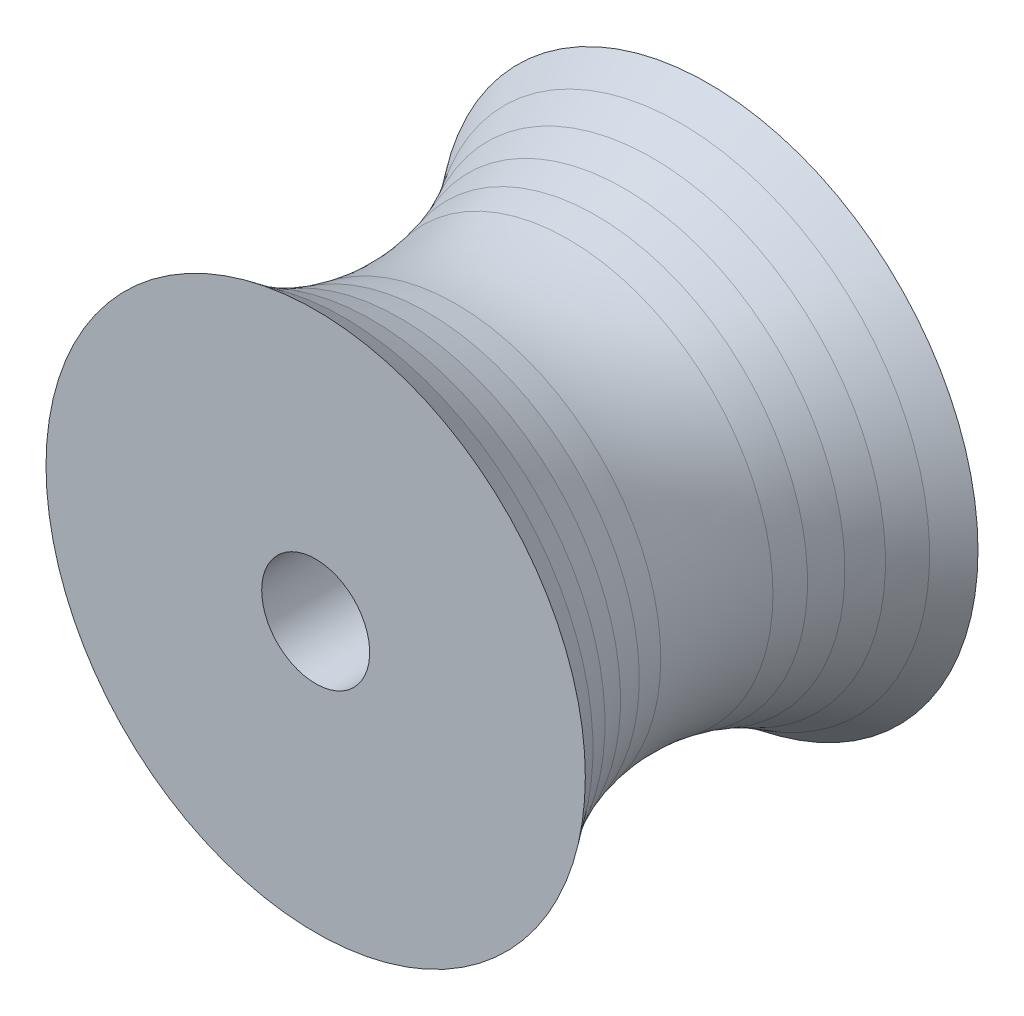
ISO-10303-21;
HEADER;
FILE_DESCRIPTION(('STEP AP214'),'2;1');
FILE_NAME('part.step','',(''),(''),'','','');
FILE_SCHEMA(('AUTOMOTIVE_DESIGN { 1 0 10303 214 1 1 1 1 }'));
ENDSEC;
DATA;
#1=APPLICATION_CONTEXT('core data for automotive mechanical design processes');
#2=APPLICATION_PROTOCOL_DEFINITION('international standard','automotive_design',2000,#1);
#3=PRODUCT_CONTEXT('',#1,'mechanical');
#4=PRODUCT('Part','Part','',(#3));
#5=PRODUCT_RELATED_PRODUCT_CATEGORY('part','',(#4));
#6=PRODUCT_DEFINITION_FORMATION('','',#4);
#7=PRODUCT_DEFINITION_CONTEXT('part definition',#1,'design');
#8=PRODUCT_DEFINITION('design','',#6,#7);
#9=PRODUCT_DEFINITION_SHAPE('','',#8);
#10=(LENGTH_UNIT() NAMED_UNIT(*) SI_UNIT(.MILLI.,.METRE.));
#11=(NAMED_UNIT(*) PLANE_ANGLE_UNIT() SI_UNIT($,.RADIAN.));
#12=(NAMED_UNIT(*) SI_UNIT($,.STERADIAN.) SOLID_ANGLE_UNIT());
#13=UNCERTAINTY_MEASURE_WITH_UNIT(LENGTH_MEASURE(1.E-05),#10,'distance_accuracy_value','');
#14=(GEOMETRIC_REPRESENTATION_CONTEXT(3) GLOBAL_UNCERTAINTY_ASSIGNED_CONTEXT((#13)) GLOBAL_UNIT_ASSIGNED_CONTEXT((#10,
#11,#12)) REPRESENTATION_CONTEXT('',''));
#15=CARTESIAN_POINT('',(0.,0.,0.));
#16=DIRECTION('',(0.,0.,1.));
#17=DIRECTION('',(1.,0.,0.));
#18=AXIS2_PLACEMENT_3D('',#15,#16,#17);
#19=CARTESIAN_POINT('',(27.4699673868949,0.,20.));
#20=DIRECTION('',(0.,0.,-1.));
#21=DIRECTION('',(-1.,0.,0.));
#22=AXIS2_PLACEMENT_3D('',#19,#20,#21);
#23=PLANE('',#22);
#24=CARTESIAN_POINT('',(0.,0.,20.));
#25=DIRECTION('',(0.,0.,-1.));
#26=DIRECTION('',(-1.,0.,0.));
#27=AXIS2_PLACEMENT_3D('',#24,#25,#26);
#28=CIRCLE('',#27,27.4699673868949);
#29=CARTESIAN_POINT('',(-27.4699673868949,0.,20.));
#30=VERTEX_POINT('',#29);
#31=EDGE_CURVE('E10',#30,#30,#28,.T.);
#32=ORIENTED_EDGE('',*,*,#31,.F.);
#33=EDGE_LOOP('',(#32));
#34=FACE_BOUND('',#33,.T.);
#35=CARTESIAN_POINT('',(0.,0.,20.));
#36=DIRECTION('',(0.,0.,-1.));
#37=DIRECTION('',(-1.,0.,0.));
#38=AXIS2_PLACEMENT_3D('',#35,#36,#37);
#39=CIRCLE('',#38,5.5);
#40=CARTESIAN_POINT('',(-5.5,0.,20.));
#41=VERTEX_POINT('',#40);
#42=EDGE_CURVE('E81',#41,#41,#39,.T.);
#43=ORIENTED_EDGE('',*,*,#42,.T.);
#44=EDGE_LOOP('',(#43));
#45=FACE_BOUND('',#44,.T.);
#46=ADVANCED_FACE('F40',(#34,#45),#23,.F.);
#47=CARTESIAN_POINT('',(0.,0.,20.));
#48=DIRECTION('',(0.,0.,1.));
#49=DIRECTION('',(1.,0.,0.));
#50=AXIS2_PLACEMENT_3D('',#47,#48,#49);
#51=CONICAL_SURFACE('',#50,27.4699673868949,0.628201058045388);
#52=CARTESIAN_POINT('',(0.,0.,17.1428571428571));
#53=DIRECTION('',(0.,0.,-1.));
#54=DIRECTION('',(-1.,0.,0.));
#55=AXIS2_PLACEMENT_3D('',#52,#53,#54);
#56=CIRCLE('',#55,25.3946443553259);
#57=CARTESIAN_POINT('',(-25.3946443553259,0.,17.1428571428571));
#58=VERTEX_POINT('',#57);
#59=EDGE_CURVE('E43',#58,#58,#56,.T.);
#60=ORIENTED_EDGE('',*,*,#59,.F.);
#61=EDGE_LOOP('',(#60));
#62=FACE_BOUND('',#61,.T.);
#63=ORIENTED_EDGE('',*,*,#31,.T.);
#64=EDGE_LOOP('',(#63));
#65=FACE_BOUND('',#64,.T.);
#66=ADVANCED_FACE('F157',(#62,#65),#51,.T.);
#67=CARTESIAN_POINT('',(0.,0.,17.1428571428571));
#68=DIRECTION('',(0.,0.,1.));
#69=DIRECTION('',(1.,0.,0.));
#70=AXIS2_PLACEMENT_3D('',#67,#68,#69);
#71=CONICAL_SURFACE('',#70,25.3946443553259,0.520339936939646);
#72=CARTESIAN_POINT('',(0.,0.,14.2857142857143));
#73=DIRECTION('',(0.,0.,-1.));
#74=DIRECTION('',(-1.,0.,0.));
#75=AXIS2_PLACEMENT_3D('',#72,#73,#74);
#76=CIRCLE('',#75,23.7574635107443);
#77=CARTESIAN_POINT('',(-23.7574635107443,0.,14.2857142857143));
#78=VERTEX_POINT('',#77);
#79=EDGE_CURVE('E50',#78,#78,#76,.T.);
#80=ORIENTED_EDGE('',*,*,#79,.F.);
#81=EDGE_LOOP('',(#80));
#82=FACE_BOUND('',#81,.T.);
#83=ORIENTED_EDGE('',*,*,#59,.T.);
#84=EDGE_LOOP('',(#83));
#85=FACE_BOUND('',#84,.T.);
#86=ADVANCED_FACE('F152',(#82,#85),#71,.T.);
#87=CARTESIAN_POINT('',(0.,0.,14.2857142857143));
#88=DIRECTION('',(0.,0.,1.));
#89=DIRECTION('',(1.,0.,0.));
#90=AXIS2_PLACEMENT_3D('',#87,#88,#89);
#91=CONICAL_SURFACE('',#90,23.7574635107443,0.418866911837247);
#92=CARTESIAN_POINT('',(0.,0.,11.4285714285714));
#93=DIRECTION('',(0.,0.,-1.));
#94=DIRECTION('',(-1.,0.,0.));
#95=AXIS2_PLACEMENT_3D('',#92,#93,#94);
#96=CIRCLE('',#95,22.4854230065542);
#97=CARTESIAN_POINT('',(-22.4854230065542,0.,11.4285714285714));
#98=VERTEX_POINT('',#97);
#99=EDGE_CURVE('E51',#98,#98,#96,.T.);
#100=ORIENTED_EDGE('',*,*,#99,.F.);
#101=EDGE_LOOP('',(#100));
#102=FACE_BOUND('',#101,.T.);
#103=ORIENTED_EDGE('',*,*,#79,.T.);
#104=EDGE_LOOP('',(#103));
#105=FACE_BOUND('',#104,.T.);
#106=ADVANCED_FACE('F144',(#102,#105),#91,.T.);
#107=CARTESIAN_POINT('',(0.,0.,11.4285714285714));
#108=DIRECTION('',(0.,0.,1.));
#109=DIRECTION('',(1.,0.,0.));
#110=AXIS2_PLACEMENT_3D('',#107,#108,#109);
#111=CONICAL_SURFACE('',#110,22.4854230065542,0.321841461472372);
#112=CARTESIAN_POINT('',(0.,0.,8.57142857142857));
#113=DIRECTION('',(0.,0.,-1.));
#114=DIRECTION('',(-1.,0.,0.));
#115=AXIS2_PLACEMENT_3D('',#112,#113,#114);
#116=CIRCLE('',#115,21.5327534515359);
#117=CARTESIAN_POINT('',(-21.5327534515359,0.,8.57142857142857));
#118=VERTEX_POINT('',#117);
#119=EDGE_CURVE('E57',#118,#118,#116,.T.);
#120=ORIENTED_EDGE('',*,*,#119,.F.);
#121=EDGE_LOOP('',(#120));
#122=FACE_BOUND('',#121,.T.);
#123=ORIENTED_EDGE('',*,*,#99,.T.);
#124=EDGE_LOOP('',(#123));
#125=FACE_BOUND('',#124,.T.);
#126=ADVANCED_FACE('F137',(#122,#125),#111,.T.);
#127=CARTESIAN_POINT('',(0.,0.,8.57142857142857));
#128=DIRECTION('',(0.,0.,1.));
#129=DIRECTION('',(1.,0.,0.));
#130=AXIS2_PLACEMENT_3D('',#127,#128,#129);
#131=CONICAL_SURFACE('',#130,21.5327534515359,0.227892830475359);
#132=CARTESIAN_POINT('',(0.,0.,5.71428571428571));
#133=DIRECTION('',(0.,0.,-1.));
#134=DIRECTION('',(-1.,0.,0.));
#135=AXIS2_PLACEMENT_3D('',#132,#133,#134);
#136=CIRCLE('',#135,20.8701198400072);
#137=CARTESIAN_POINT('',(-20.8701198400072,0.,5.71428571428571));
#138=VERTEX_POINT('',#137);
#139=EDGE_CURVE('E56',#138,#138,#136,.T.);
#140=ORIENTED_EDGE('',*,*,#139,.F.);
#141=EDGE_LOOP('',(#140));
#142=FACE_BOUND('',#141,.T.);
#143=ORIENTED_EDGE('',*,*,#119,.T.);
#144=EDGE_LOOP('',(#143));
#145=FACE_BOUND('',#144,.T.);
#146=ADVANCED_FACE('F133',(#142,#145),#131,.T.);
#147=CARTESIAN_POINT('',(0.,0.,0.));
#148=DIRECTION('',(0.,0.,-1.));
#149=DIRECTION('',(-1.,0.,0.));
#150=AXIS2_PLACEMENT_3D('',#147,#148,#149);
#151=TOROIDAL_SURFACE('',#150,52.0000000000004,31.6500000000004);
#152=CARTESIAN_POINT('',(0.,0.,-5.71428571428571));
#153=DIRECTION('',(0.,0.,-1.));
#154=DIRECTION('',(-1.,0.,0.));
#155=AXIS2_PLACEMENT_3D('',#152,#153,#154);
#156=CIRCLE('',#155,20.8701198400073);
#157=CARTESIAN_POINT('',(-20.8701198400073,0.,-5.71428571428571));
#158=VERTEX_POINT('',#157);
#159=EDGE_CURVE('E64',#158,#158,#156,.T.);
#160=ORIENTED_EDGE('',*,*,#159,.F.);
#161=EDGE_LOOP('',(#160));
#162=FACE_BOUND('',#161,.T.);
#163=ORIENTED_EDGE('',*,*,#139,.T.);
#164=EDGE_LOOP('',(#163));
#165=FACE_BOUND('',#164,.T.);
#166=ADVANCED_FACE('F130',(#162,#165),#151,.F.);
#167=CARTESIAN_POINT('',(0.,0.,-5.71428571428571));
#168=DIRECTION('',(0.,0.,-1.));
#169=DIRECTION('',(-1.,0.,0.));
#170=AXIS2_PLACEMENT_3D('',#167,#168,#169);
#171=CONICAL_SURFACE('',#170,20.8701198400073,0.227892830475356);
#172=CARTESIAN_POINT('',(0.,0.,-8.57142857142857));
#173=DIRECTION('',(0.,0.,-1.));
#174=DIRECTION('',(-1.,0.,0.));
#175=AXIS2_PLACEMENT_3D('',#172,#173,#174);
#176=CIRCLE('',#175,21.5327534515359);
#177=CARTESIAN_POINT('',(-21.5327534515359,0.,-8.57142857142857));
#178=VERTEX_POINT('',#177);
#179=EDGE_CURVE('E63',#178,#178,#176,.T.);
#180=ORIENTED_EDGE('',*,*,#179,.F.);
#181=EDGE_LOOP('',(#180));
#182=FACE_BOUND('',#181,.T.);
#183=ORIENTED_EDGE('',*,*,#159,.T.);
#184=EDGE_LOOP('',(#183));
#185=FACE_BOUND('',#184,.T.);
#186=ADVANCED_FACE('F123',(#182,#185),#171,.T.);
#187=CARTESIAN_POINT('',(0.,0.,-8.57142857142857));
#188=DIRECTION('',(0.,0.,-1.));
#189=DIRECTION('',(-1.,0.,0.));
#190=AXIS2_PLACEMENT_3D('',#187,#188,#189);
#191=CONICAL_SURFACE('',#190,21.5327534515359,0.321841461472371);
#192=CARTESIAN_POINT('',(0.,0.,-11.4285714285714));
#193=DIRECTION('',(0.,0.,-1.));
#194=DIRECTION('',(-1.,0.,0.));
#195=AXIS2_PLACEMENT_3D('',#192,#193,#194);
#196=CIRCLE('',#195,22.4854230065542);
#197=CARTESIAN_POINT('',(-22.4854230065542,0.,-11.4285714285714));
#198=VERTEX_POINT('',#197);
#199=EDGE_CURVE('E66',#198,#198,#196,.T.);
#200=ORIENTED_EDGE('',*,*,#199,.F.);
#201=EDGE_LOOP('',(#200));
#202=FACE_BOUND('',#201,.T.);
#203=ORIENTED_EDGE('',*,*,#179,.T.);
#204=EDGE_LOOP('',(#203));
#205=FACE_BOUND('',#204,.T.);
#206=ADVANCED_FACE('F113',(#202,#205),#191,.T.);
#207=CARTESIAN_POINT('',(0.,0.,-11.4285714285714));
#208=DIRECTION('',(0.,0.,-1.));
#209=DIRECTION('',(-1.,0.,0.));
#210=AXIS2_PLACEMENT_3D('',#207,#208,#209);
#211=CONICAL_SURFACE('',#210,22.4854230065542,0.418866911837247);
#212=CARTESIAN_POINT('',(0.,0.,-14.2857142857143));
#213=DIRECTION('',(0.,0.,-1.));
#214=DIRECTION('',(-1.,0.,0.));
#215=AXIS2_PLACEMENT_3D('',#212,#213,#214);
#216=CIRCLE('',#215,23.7574635107443);
#217=CARTESIAN_POINT('',(-23.7574635107443,0.,-14.2857142857143));
#218=VERTEX_POINT('',#217);
#219=EDGE_CURVE('E72',#218,#218,#216,.T.);
#220=ORIENTED_EDGE('',*,*,#219,.F.);
#221=EDGE_LOOP('',(#220));
#222=FACE_BOUND('',#221,.T.);
#223=ORIENTED_EDGE('',*,*,#199,.T.);
#224=EDGE_LOOP('',(#223));
#225=FACE_BOUND('',#224,.T.);
#226=ADVANCED_FACE('F106',(#222,#225),#211,.T.);
#227=CARTESIAN_POINT('',(0.,0.,-14.2857142857143));
#228=DIRECTION('',(0.,0.,-1.));
#229=DIRECTION('',(-1.,0.,0.));
#230=AXIS2_PLACEMENT_3D('',#227,#228,#229);
#231=CONICAL_SURFACE('',#230,23.7574635107443,0.520339936939647);
#232=CARTESIAN_POINT('',(0.,0.,-17.1428571428571));
#233=DIRECTION('',(0.,0.,-1.));
#234=DIRECTION('',(-1.,0.,0.));
#235=AXIS2_PLACEMENT_3D('',#232,#233,#234);
#236=CIRCLE('',#235,25.3946443553259);
#237=CARTESIAN_POINT('',(-25.3946443553259,0.,-17.1428571428571));
#238=VERTEX_POINT('',#237);
#239=EDGE_CURVE('E71',#238,#238,#236,.T.);
#240=ORIENTED_EDGE('',*,*,#239,.F.);
#241=EDGE_LOOP('',(#240));
#242=FACE_BOUND('',#241,.T.);
#243=ORIENTED_EDGE('',*,*,#219,.T.);
#244=EDGE_LOOP('',(#243));
#245=FACE_BOUND('',#244,.T.);
#246=ADVANCED_FACE('F104',(#242,#245),#231,.T.);
#247=CARTESIAN_POINT('',(0.,0.,-17.1428571428571));
#248=DIRECTION('',(0.,0.,-1.));
#249=DIRECTION('',(-1.,0.,0.));
#250=AXIS2_PLACEMENT_3D('',#247,#248,#249);
#251=CONICAL_SURFACE('',#250,25.3946443553259,0.628201058045387);
#252=CARTESIAN_POINT('',(0.,0.,-20.));
#253=DIRECTION('',(0.,0.,-1.));
#254=DIRECTION('',(-1.,0.,0.));
#255=AXIS2_PLACEMENT_3D('',#252,#253,#254);
#256=CIRCLE('',#255,27.4699673868949);
#257=CARTESIAN_POINT('',(-27.4699673868949,0.,-20.));
#258=VERTEX_POINT('',#257);
#259=EDGE_CURVE('E77',#258,#258,#256,.T.);
#260=ORIENTED_EDGE('',*,*,#259,.F.);
#261=EDGE_LOOP('',(#260));
#262=FACE_BOUND('',#261,.T.);
#263=ORIENTED_EDGE('',*,*,#239,.T.);
#264=EDGE_LOOP('',(#263));
#265=FACE_BOUND('',#264,.T.);
#266=ADVANCED_FACE('F100',(#262,#265),#251,.T.);
#267=CARTESIAN_POINT('',(5.5,0.,-20.));
#268=DIRECTION('',(0.,0.,1.));
#269=DIRECTION('',(1.,0.,0.));
#270=AXIS2_PLACEMENT_3D('',#267,#268,#269);
#271=PLANE('',#270);
#272=CARTESIAN_POINT('',(0.,0.,-20.));
#273=DIRECTION('',(0.,0.,-1.));
#274=DIRECTION('',(-1.,0.,0.));
#275=AXIS2_PLACEMENT_3D('',#272,#273,#274);
#276=CIRCLE('',#275,5.5);
#277=CARTESIAN_POINT('',(-5.5,0.,-20.));
#278=VERTEX_POINT('',#277);
#279=EDGE_CURVE('E79',#278,#278,#276,.T.);
#280=ORIENTED_EDGE('',*,*,#279,.F.);
#281=EDGE_LOOP('',(#280));
#282=FACE_BOUND('',#281,.T.);
#283=ORIENTED_EDGE('',*,*,#259,.T.);
#284=EDGE_LOOP('',(#283));
#285=FACE_BOUND('',#284,.T.);
#286=ADVANCED_FACE('F91',(#282,#285),#271,.F.);
#287=CARTESIAN_POINT('',(0.,0.,-25.));
#288=DIRECTION('',(0.,0.,-1.));
#289=DIRECTION('',(-1.,0.,0.));
#290=AXIS2_PLACEMENT_3D('',#287,#288,#289);
#291=CYLINDRICAL_SURFACE('',#290,5.5);
#292=ORIENTED_EDGE('',*,*,#42,.F.);
#293=EDGE_LOOP('',(#292));
#294=FACE_BOUND('',#293,.T.);
#295=ORIENTED_EDGE('',*,*,#279,.T.);
#296=EDGE_LOOP('',(#295));
#297=FACE_BOUND('',#296,.T.);
#298=ADVANCED_FACE('F88',(#294,#297),#291,.F.);
#299=CLOSED_SHELL('',(#46,#66,#86,#106,#126,#146,#166,#186,#206,#226,#246,#266,#286,#298));
#300=MANIFOLD_SOLID_BREP('B2',#299);
#301=ADVANCED_BREP_SHAPE_REPRESENTATION('',(#18,#300),#14);
#302=SHAPE_DEFINITION_REPRESENTATION(#9,#301);
ENDSEC;
END-ISO-10303-21;
